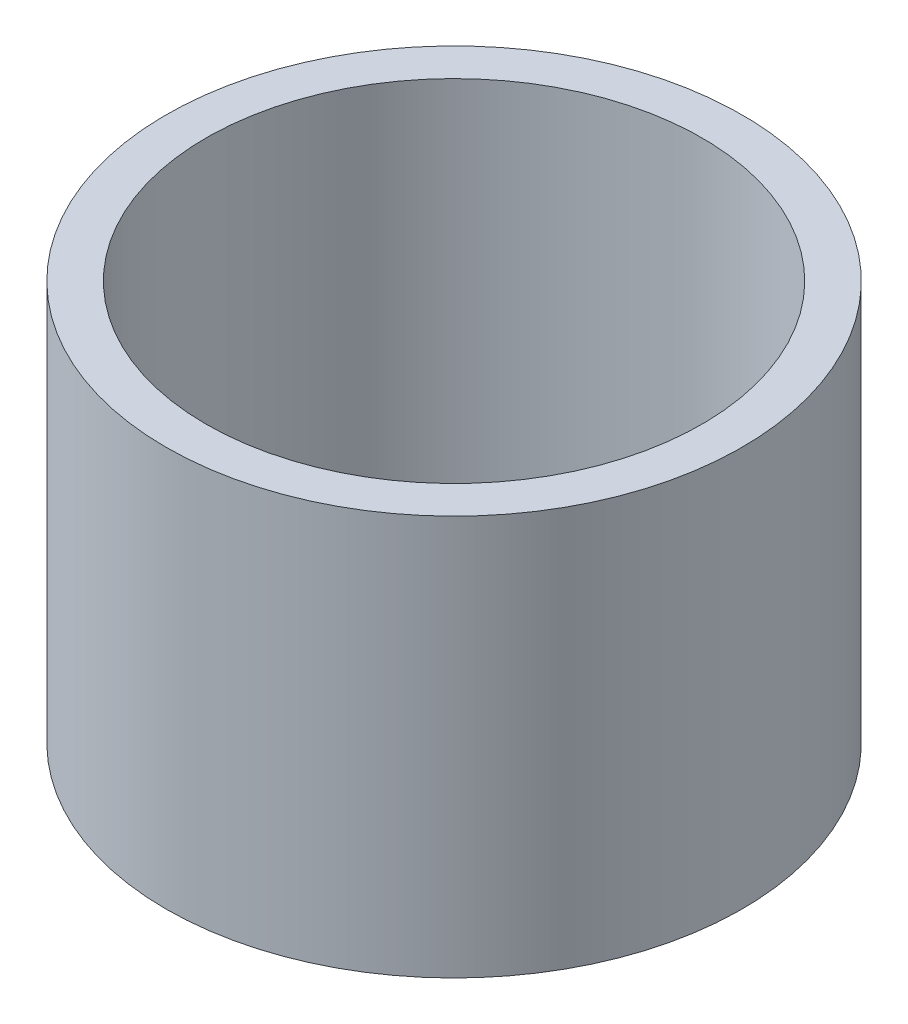
ISO-10303-21;
HEADER;
FILE_DESCRIPTION(('STEP AP214'),'2;1');
FILE_NAME('part.step','',(''),(''),'','','');
FILE_SCHEMA(('AUTOMOTIVE_DESIGN { 1 0 10303 214 1 1 1 1 }'));
ENDSEC;
DATA;
#1=APPLICATION_CONTEXT('core data for automotive mechanical design processes');
#2=APPLICATION_PROTOCOL_DEFINITION('international standard','automotive_design',2000,#1);
#3=PRODUCT_CONTEXT('',#1,'mechanical');
#4=PRODUCT('Part','Part','',(#3));
#5=PRODUCT_RELATED_PRODUCT_CATEGORY('part','',(#4));
#6=PRODUCT_DEFINITION_FORMATION('','',#4);
#7=PRODUCT_DEFINITION_CONTEXT('part definition',#1,'design');
#8=PRODUCT_DEFINITION('design','',#6,#7);
#9=PRODUCT_DEFINITION_SHAPE('','',#8);
#10=(LENGTH_UNIT() NAMED_UNIT(*) SI_UNIT(.MILLI.,.METRE.));
#11=(NAMED_UNIT(*) PLANE_ANGLE_UNIT() SI_UNIT($,.RADIAN.));
#12=(NAMED_UNIT(*) SI_UNIT($,.STERADIAN.) SOLID_ANGLE_UNIT());
#13=UNCERTAINTY_MEASURE_WITH_UNIT(LENGTH_MEASURE(1.E-05),#10,'distance_accuracy_value','');
#14=(GEOMETRIC_REPRESENTATION_CONTEXT(3) GLOBAL_UNCERTAINTY_ASSIGNED_CONTEXT((#13)) GLOBAL_UNIT_ASSIGNED_CONTEXT((#10,
#11,#12)) REPRESENTATION_CONTEXT('',''));
#15=CARTESIAN_POINT('',(0.,0.,0.));
#16=DIRECTION('',(0.,0.,1.));
#17=DIRECTION('',(1.,0.,0.));
#18=AXIS2_PLACEMENT_3D('',#15,#16,#17);
#19=CARTESIAN_POINT('',(0.,5.,0.));
#20=DIRECTION('',(0.,-1.,0.));
#21=DIRECTION('',(0.,0.,-1.));
#22=AXIS2_PLACEMENT_3D('',#19,#20,#21);
#23=CYLINDRICAL_SURFACE('',#22,3.6);
#24=CARTESIAN_POINT('',(0.,5.,0.));
#25=DIRECTION('',(0.,1.,0.));
#26=DIRECTION('',(0.,0.,1.));
#27=AXIS2_PLACEMENT_3D('',#24,#25,#26);
#28=CIRCLE('',#27,3.6);
#29=CARTESIAN_POINT('',(0.,5.,3.6));
#30=VERTEX_POINT('',#29);
#31=EDGE_CURVE('E10',#30,#30,#28,.T.);
#32=ORIENTED_EDGE('',*,*,#31,.F.);
#33=EDGE_LOOP('',(#32));
#34=FACE_BOUND('',#33,.T.);
#35=CARTESIAN_POINT('',(0.,0.,0.));
#36=DIRECTION('',(0.,1.,0.));
#37=DIRECTION('',(0.,0.,1.));
#38=AXIS2_PLACEMENT_3D('',#35,#36,#37);
#39=CIRCLE('',#38,3.6);
#40=CARTESIAN_POINT('',(0.,0.,3.6));
#41=VERTEX_POINT('',#40);
#42=EDGE_CURVE('E46',#41,#41,#39,.T.);
#43=ORIENTED_EDGE('',*,*,#42,.T.);
#44=EDGE_LOOP('',(#43));
#45=FACE_BOUND('',#44,.T.);
#46=ADVANCED_FACE('F43',(#34,#45),#23,.T.);
#47=CARTESIAN_POINT('',(0.,5.,0.));
#48=DIRECTION('',(0.,1.,0.));
#49=DIRECTION('',(0.,0.,1.));
#50=AXIS2_PLACEMENT_3D('',#47,#48,#49);
#51=PLANE('',#50);
#52=CARTESIAN_POINT('',(0.,5.,0.));
#53=DIRECTION('',(0.,1.,0.));
#54=DIRECTION('',(0.,0.,1.));
#55=AXIS2_PLACEMENT_3D('',#52,#53,#54);
#56=CIRCLE('',#55,3.1);
#57=CARTESIAN_POINT('',(0.,5.,3.1));
#58=VERTEX_POINT('',#57);
#59=EDGE_CURVE('E57',#58,#58,#56,.T.);
#60=ORIENTED_EDGE('',*,*,#59,.F.);
#61=EDGE_LOOP('',(#60));
#62=FACE_BOUND('',#61,.T.);
#63=ORIENTED_EDGE('',*,*,#31,.T.);
#64=EDGE_LOOP('',(#63));
#65=FACE_BOUND('',#64,.T.);
#66=ADVANCED_FACE('F74',(#62,#65),#51,.T.);
#67=CARTESIAN_POINT('',(0.,0.,0.));
#68=DIRECTION('',(0.,1.,0.));
#69=DIRECTION('',(0.,0.,1.));
#70=AXIS2_PLACEMENT_3D('',#67,#68,#69);
#71=PLANE('',#70);
#72=ORIENTED_EDGE('',*,*,#42,.F.);
#73=EDGE_LOOP('',(#72));
#74=FACE_BOUND('',#73,.T.);
#75=ADVANCED_FACE('F70',(#74),#71,.F.);
#76=CARTESIAN_POINT('',(0.,0.5,0.));
#77=DIRECTION('',(0.,1.,0.));
#78=DIRECTION('',(0.,0.,1.));
#79=AXIS2_PLACEMENT_3D('',#76,#77,#78);
#80=CYLINDRICAL_SURFACE('',#79,3.1);
#81=CARTESIAN_POINT('',(0.,0.5,0.));
#82=DIRECTION('',(0.,1.,0.));
#83=DIRECTION('',(0.,0.,1.));
#84=AXIS2_PLACEMENT_3D('',#81,#82,#83);
#85=CIRCLE('',#84,3.1);
#86=CARTESIAN_POINT('',(0.,0.5,3.1));
#87=VERTEX_POINT('',#86);
#88=EDGE_CURVE('E55',#87,#87,#85,.T.);
#89=ORIENTED_EDGE('',*,*,#88,.F.);
#90=EDGE_LOOP('',(#89));
#91=FACE_BOUND('',#90,.T.);
#92=ORIENTED_EDGE('',*,*,#59,.T.);
#93=EDGE_LOOP('',(#92));
#94=FACE_BOUND('',#93,.T.);
#95=ADVANCED_FACE('F67',(#91,#94),#80,.F.);
#96=CARTESIAN_POINT('',(0.,0.5,0.));
#97=DIRECTION('',(0.,1.,0.));
#98=DIRECTION('',(0.,0.,1.));
#99=AXIS2_PLACEMENT_3D('',#96,#97,#98);
#100=PLANE('',#99);
#101=ORIENTED_EDGE('',*,*,#88,.T.);
#102=EDGE_LOOP('',(#101));
#103=FACE_BOUND('',#102,.T.);
#104=ADVANCED_FACE('F65',(#103),#100,.T.);
#105=CLOSED_SHELL('',(#46,#66,#75,#95,#104));
#106=MANIFOLD_SOLID_BREP('B2',#105);
#107=ADVANCED_BREP_SHAPE_REPRESENTATION('',(#18,#106),#14);
#108=SHAPE_DEFINITION_REPRESENTATION(#9,#107);
ENDSEC;
END-ISO-10303-21;
